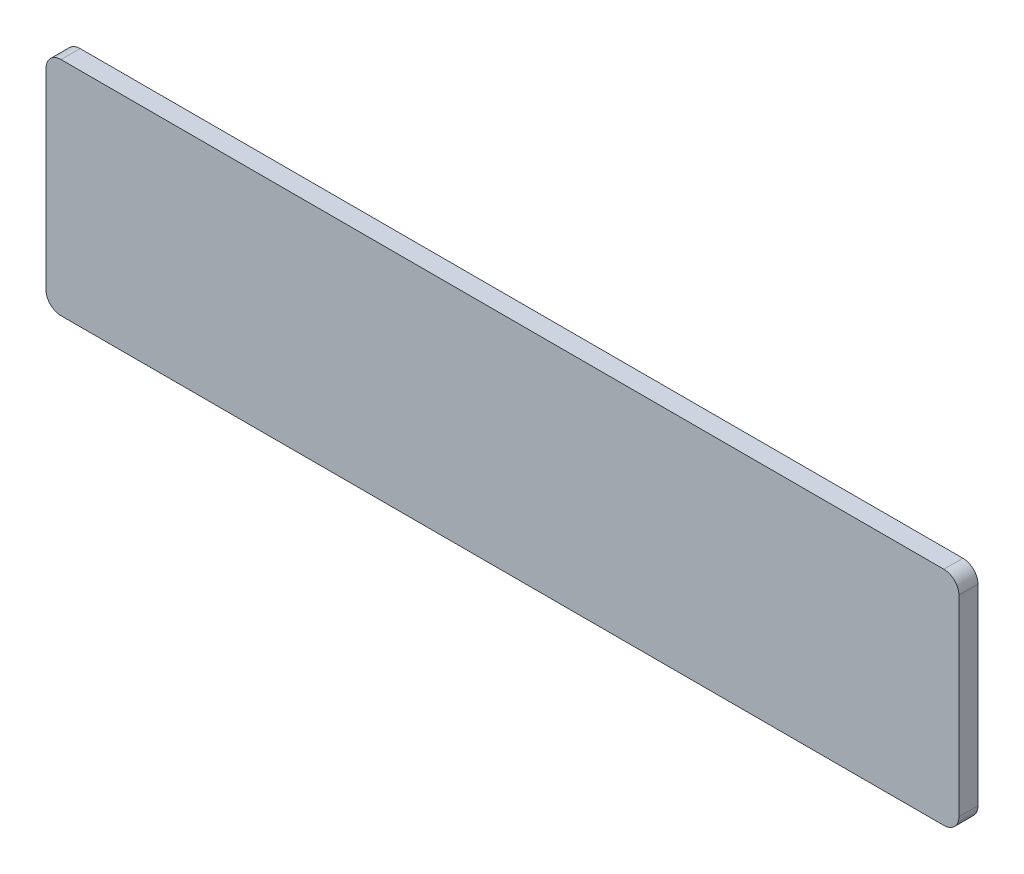
ISO-10303-21;
HEADER;
FILE_DESCRIPTION(('STEP AP214'),'2;1');
FILE_NAME('part.step','',(''),(''),'','','');
FILE_SCHEMA(('AUTOMOTIVE_DESIGN { 1 0 10303 214 1 1 1 1 }'));
ENDSEC;
DATA;
#1=APPLICATION_CONTEXT('core data for automotive mechanical design processes');
#2=APPLICATION_PROTOCOL_DEFINITION('international standard','automotive_design',2000,#1);
#3=PRODUCT_CONTEXT('',#1,'mechanical');
#4=PRODUCT('Part','Part','',(#3));
#5=PRODUCT_RELATED_PRODUCT_CATEGORY('part','',(#4));
#6=PRODUCT_DEFINITION_FORMATION('','',#4);
#7=PRODUCT_DEFINITION_CONTEXT('part definition',#1,'design');
#8=PRODUCT_DEFINITION('design','',#6,#7);
#9=PRODUCT_DEFINITION_SHAPE('','',#8);
#10=(LENGTH_UNIT() NAMED_UNIT(*) SI_UNIT(.MILLI.,.METRE.));
#11=(NAMED_UNIT(*) PLANE_ANGLE_UNIT() SI_UNIT($,.RADIAN.));
#12=(NAMED_UNIT(*) SI_UNIT($,.STERADIAN.) SOLID_ANGLE_UNIT());
#13=UNCERTAINTY_MEASURE_WITH_UNIT(LENGTH_MEASURE(1.E-05),#10,'distance_accuracy_value','');
#14=(GEOMETRIC_REPRESENTATION_CONTEXT(3) GLOBAL_UNCERTAINTY_ASSIGNED_CONTEXT((#13)) GLOBAL_UNIT_ASSIGNED_CONTEXT((#10,
#11,#12)) REPRESENTATION_CONTEXT('',''));
#15=CARTESIAN_POINT('',(0.,0.,0.));
#16=DIRECTION('',(0.,0.,1.));
#17=DIRECTION('',(1.,0.,0.));
#18=AXIS2_PLACEMENT_3D('',#15,#16,#17);
#19=CARTESIAN_POINT('',(0.,0.,12.7));
#20=DIRECTION('',(-1.,0.,0.));
#21=DIRECTION('',(0.,0.,1.));
#22=AXIS2_PLACEMENT_3D('',#19,#20,#21);
#23=PLANE('',#22);
#24=DIRECTION('',(0.,1.,0.));
#25=VECTOR('',#24,1.);
#26=CARTESIAN_POINT('',(0.,0.,12.7));
#27=LINE('',#26,#25);
#28=CARTESIAN_POINT('',(0.,10.,12.7));
#29=VERTEX_POINT('',#28);
#30=CARTESIAN_POINT('',(0.,137.67,12.7));
#31=VERTEX_POINT('',#30);
#32=EDGE_CURVE('E130',#29,#31,#27,.T.);
#33=ORIENTED_EDGE('',*,*,#32,.F.);
#34=DIRECTION('',(0.,0.,-1.));
#35=VECTOR('',#34,1.);
#36=CARTESIAN_POINT('',(0.,10.,12.7));
#37=LINE('',#36,#35);
#38=CARTESIAN_POINT('',(0.,10.,0.));
#39=VERTEX_POINT('',#38);
#40=EDGE_CURVE('E114',#29,#39,#37,.T.);
#41=ORIENTED_EDGE('',*,*,#40,.T.);
#42=DIRECTION('',(0.,1.,0.));
#43=VECTOR('',#42,1.);
#44=CARTESIAN_POINT('',(0.,0.,0.));
#45=LINE('',#44,#43);
#46=CARTESIAN_POINT('',(0.,137.67,0.));
#47=VERTEX_POINT('',#46);
#48=EDGE_CURVE('E127',#39,#47,#45,.T.);
#49=ORIENTED_EDGE('',*,*,#48,.T.);
#50=DIRECTION('',(0.,0.,-1.));
#51=VECTOR('',#50,1.);
#52=CARTESIAN_POINT('',(0.,137.67,12.7));
#53=LINE('',#52,#51);
#54=EDGE_CURVE('E133',#47,#31,#53,.F.);
#55=ORIENTED_EDGE('',*,*,#54,.T.);
#56=EDGE_LOOP('',(#33,#41,#49,#55));
#57=FACE_BOUND('',#56,.T.);
#58=ADVANCED_FACE('F43',(#57),#23,.F.);
#59=CARTESIAN_POINT('',(0.,147.67,12.7));
#60=DIRECTION('',(0.,-1.,0.));
#61=DIRECTION('',(1.,0.,0.));
#62=AXIS2_PLACEMENT_3D('',#59,#60,#61);
#63=PLANE('',#62);
#64=DIRECTION('',(-1.,0.,0.));
#65=VECTOR('',#64,1.);
#66=CARTESIAN_POINT('',(0.,147.67,0.));
#67=LINE('',#66,#65);
#68=CARTESIAN_POINT('',(-10.,147.67,0.));
#69=VERTEX_POINT('',#68);
#70=CARTESIAN_POINT('',(-597.57,147.67,0.));
#71=VERTEX_POINT('',#70);
#72=EDGE_CURVE('E138',#69,#71,#67,.T.);
#73=ORIENTED_EDGE('',*,*,#72,.T.);
#74=DIRECTION('',(0.,0.,-1.));
#75=VECTOR('',#74,1.);
#76=CARTESIAN_POINT('',(-597.57,147.67,12.7));
#77=LINE('',#76,#75);
#78=CARTESIAN_POINT('',(-597.57,147.67,12.7));
#79=VERTEX_POINT('',#78);
#80=EDGE_CURVE('E11',#71,#79,#77,.F.);
#81=ORIENTED_EDGE('',*,*,#80,.T.);
#82=DIRECTION('',(-1.,0.,0.));
#83=VECTOR('',#82,1.);
#84=CARTESIAN_POINT('',(0.,147.67,12.7));
#85=LINE('',#84,#83);
#86=CARTESIAN_POINT('',(-10.,147.67,12.7));
#87=VERTEX_POINT('',#86);
#88=EDGE_CURVE('E190',#87,#79,#85,.T.);
#89=ORIENTED_EDGE('',*,*,#88,.F.);
#90=DIRECTION('',(0.,0.,-1.));
#91=VECTOR('',#90,1.);
#92=CARTESIAN_POINT('',(-10.,147.67,12.7));
#93=LINE('',#92,#91);
#94=EDGE_CURVE('E52',#87,#69,#93,.T.);
#95=ORIENTED_EDGE('',*,*,#94,.T.);
#96=EDGE_LOOP('',(#73,#81,#89,#95));
#97=FACE_BOUND('',#96,.T.);
#98=ADVANCED_FACE('F188',(#97),#63,.F.);
#99=CARTESIAN_POINT('',(-607.57,0.,12.7));
#100=DIRECTION('',(1.,0.,0.));
#101=DIRECTION('',(0.,0.,-1.));
#102=AXIS2_PLACEMENT_3D('',#99,#100,#101);
#103=PLANE('',#102);
#104=DIRECTION('',(0.,-1.,0.));
#105=VECTOR('',#104,1.);
#106=CARTESIAN_POINT('',(-607.57,0.,0.));
#107=LINE('',#106,#105);
#108=CARTESIAN_POINT('',(-607.57,137.67,0.));
#109=VERTEX_POINT('',#108);
#110=CARTESIAN_POINT('',(-607.57,10.,0.));
#111=VERTEX_POINT('',#110);
#112=EDGE_CURVE('E142',#109,#111,#107,.T.);
#113=ORIENTED_EDGE('',*,*,#112,.T.);
#114=DIRECTION('',(0.,0.,-1.));
#115=VECTOR('',#114,1.);
#116=CARTESIAN_POINT('',(-607.57,10.,12.7));
#117=LINE('',#116,#115);
#118=CARTESIAN_POINT('',(-607.57,10.,12.7));
#119=VERTEX_POINT('',#118);
#120=EDGE_CURVE('E59',#111,#119,#117,.F.);
#121=ORIENTED_EDGE('',*,*,#120,.T.);
#122=DIRECTION('',(0.,-1.,0.));
#123=VECTOR('',#122,1.);
#124=CARTESIAN_POINT('',(-607.57,0.,12.7));
#125=LINE('',#124,#123);
#126=CARTESIAN_POINT('',(-607.57,137.67,12.7));
#127=VERTEX_POINT('',#126);
#128=EDGE_CURVE('E198',#127,#119,#125,.T.);
#129=ORIENTED_EDGE('',*,*,#128,.F.);
#130=DIRECTION('',(0.,0.,-1.));
#131=VECTOR('',#130,1.);
#132=CARTESIAN_POINT('',(-607.57,137.67,12.7));
#133=LINE('',#132,#131);
#134=EDGE_CURVE('E178',#127,#109,#133,.T.);
#135=ORIENTED_EDGE('',*,*,#134,.T.);
#136=EDGE_LOOP('',(#113,#121,#129,#135));
#137=FACE_BOUND('',#136,.T.);
#138=ADVANCED_FACE('F197',(#137),#103,.F.);
#139=CARTESIAN_POINT('',(0.,0.,12.7));
#140=DIRECTION('',(0.,1.,0.));
#141=DIRECTION('',(0.,0.,1.));
#142=AXIS2_PLACEMENT_3D('',#139,#140,#141);
#143=PLANE('',#142);
#144=DIRECTION('',(1.,0.,0.));
#145=VECTOR('',#144,1.);
#146=CARTESIAN_POINT('',(0.,0.,0.));
#147=LINE('',#146,#145);
#148=CARTESIAN_POINT('',(-597.57,0.,0.));
#149=VERTEX_POINT('',#148);
#150=CARTESIAN_POINT('',(-10.,0.,0.));
#151=VERTEX_POINT('',#150);
#152=EDGE_CURVE('E150',#149,#151,#147,.T.);
#153=ORIENTED_EDGE('',*,*,#152,.T.);
#154=DIRECTION('',(0.,0.,-1.));
#155=VECTOR('',#154,1.);
#156=CARTESIAN_POINT('',(-10.,0.,12.7));
#157=LINE('',#156,#155);
#158=CARTESIAN_POINT('',(-10.,0.,12.7));
#159=VERTEX_POINT('',#158);
#160=EDGE_CURVE('E115',#151,#159,#157,.F.);
#161=ORIENTED_EDGE('',*,*,#160,.T.);
#162=DIRECTION('',(1.,0.,0.));
#163=VECTOR('',#162,1.);
#164=CARTESIAN_POINT('',(0.,0.,12.7));
#165=LINE('',#164,#163);
#166=CARTESIAN_POINT('',(-597.57,0.,12.7));
#167=VERTEX_POINT('',#166);
#168=EDGE_CURVE('E145',#167,#159,#165,.T.);
#169=ORIENTED_EDGE('',*,*,#168,.F.);
#170=DIRECTION('',(0.,0.,-1.));
#171=VECTOR('',#170,1.);
#172=CARTESIAN_POINT('',(-597.57,0.,12.7));
#173=LINE('',#172,#171);
#174=EDGE_CURVE('E121',#167,#149,#173,.T.);
#175=ORIENTED_EDGE('',*,*,#174,.T.);
#176=EDGE_LOOP('',(#153,#161,#169,#175));
#177=FACE_BOUND('',#176,.T.);
#178=ADVANCED_FACE('F230',(#177),#143,.F.);
#179=CARTESIAN_POINT('',(0.,0.,12.7));
#180=DIRECTION('',(0.,0.,1.));
#181=DIRECTION('',(1.,0.,0.));
#182=AXIS2_PLACEMENT_3D('',#179,#180,#181);
#183=PLANE('',#182);
#184=ORIENTED_EDGE('',*,*,#168,.T.);
#185=CARTESIAN_POINT('',(-10.,10.,12.7));
#186=DIRECTION('',(0.,0.,1.));
#187=DIRECTION('',(1.,0.,0.));
#188=AXIS2_PLACEMENT_3D('',#185,#186,#187);
#189=CIRCLE('',#188,10.);
#190=EDGE_CURVE('E175',#159,#29,#189,.T.);
#191=ORIENTED_EDGE('',*,*,#190,.T.);
#192=ORIENTED_EDGE('',*,*,#32,.T.);
#193=CARTESIAN_POINT('',(-10.,137.67,12.7));
#194=DIRECTION('',(0.,0.,1.));
#195=DIRECTION('',(1.,0.,0.));
#196=AXIS2_PLACEMENT_3D('',#193,#194,#195);
#197=CIRCLE('',#196,10.);
#198=EDGE_CURVE('E167',#31,#87,#197,.T.);
#199=ORIENTED_EDGE('',*,*,#198,.T.);
#200=ORIENTED_EDGE('',*,*,#88,.T.);
#201=CARTESIAN_POINT('',(-597.57,137.67,12.7));
#202=DIRECTION('',(0.,0.,1.));
#203=DIRECTION('',(1.,0.,0.));
#204=AXIS2_PLACEMENT_3D('',#201,#202,#203);
#205=CIRCLE('',#204,10.);
#206=EDGE_CURVE('E66',#79,#127,#205,.T.);
#207=ORIENTED_EDGE('',*,*,#206,.T.);
#208=ORIENTED_EDGE('',*,*,#128,.T.);
#209=CARTESIAN_POINT('',(-597.57,10.,12.7));
#210=DIRECTION('',(0.,0.,1.));
#211=DIRECTION('',(1.,0.,0.));
#212=AXIS2_PLACEMENT_3D('',#209,#210,#211);
#213=CIRCLE('',#212,10.);
#214=EDGE_CURVE('E172',#119,#167,#213,.T.);
#215=ORIENTED_EDGE('',*,*,#214,.T.);
#216=EDGE_LOOP('',(#184,#191,#192,#199,#200,#207,#208,#215));
#217=FACE_BOUND('',#216,.T.);
#218=ADVANCED_FACE('F207',(#217),#183,.T.);
#219=CARTESIAN_POINT('',(0.,0.,0.));
#220=DIRECTION('',(0.,0.,1.));
#221=DIRECTION('',(1.,0.,0.));
#222=AXIS2_PLACEMENT_3D('',#219,#220,#221);
#223=PLANE('',#222);
#224=ORIENTED_EDGE('',*,*,#48,.F.);
#225=CARTESIAN_POINT('',(-10.,10.,0.));
#226=DIRECTION('',(0.,0.,1.));
#227=DIRECTION('',(1.,0.,0.));
#228=AXIS2_PLACEMENT_3D('',#225,#226,#227);
#229=CIRCLE('',#228,10.);
#230=EDGE_CURVE('E110',#39,#151,#229,.F.);
#231=ORIENTED_EDGE('',*,*,#230,.T.);
#232=ORIENTED_EDGE('',*,*,#152,.F.);
#233=CARTESIAN_POINT('',(-597.57,10.,0.));
#234=DIRECTION('',(0.,0.,1.));
#235=DIRECTION('',(1.,0.,0.));
#236=AXIS2_PLACEMENT_3D('',#233,#234,#235);
#237=CIRCLE('',#236,10.);
#238=EDGE_CURVE('E122',#149,#111,#237,.F.);
#239=ORIENTED_EDGE('',*,*,#238,.T.);
#240=ORIENTED_EDGE('',*,*,#112,.F.);
#241=CARTESIAN_POINT('',(-597.57,137.67,0.));
#242=DIRECTION('',(0.,0.,1.));
#243=DIRECTION('',(1.,0.,0.));
#244=AXIS2_PLACEMENT_3D('',#241,#242,#243);
#245=CIRCLE('',#244,10.);
#246=EDGE_CURVE('E157',#109,#71,#245,.F.);
#247=ORIENTED_EDGE('',*,*,#246,.T.);
#248=ORIENTED_EDGE('',*,*,#72,.F.);
#249=CARTESIAN_POINT('',(-10.,137.67,0.));
#250=DIRECTION('',(0.,0.,1.));
#251=DIRECTION('',(1.,0.,0.));
#252=AXIS2_PLACEMENT_3D('',#249,#250,#251);
#253=CIRCLE('',#252,10.);
#254=EDGE_CURVE('E132',#69,#47,#253,.F.);
#255=ORIENTED_EDGE('',*,*,#254,.T.);
#256=EDGE_LOOP('',(#224,#231,#232,#239,#240,#247,#248,#255));
#257=FACE_BOUND('',#256,.T.);
#258=ADVANCED_FACE('F135',(#257),#223,.F.);
#259=CARTESIAN_POINT('',(-10.,10.,12.7));
#260=DIRECTION('',(0.,0.,-1.));
#261=DIRECTION('',(-1.,0.,0.));
#262=AXIS2_PLACEMENT_3D('',#259,#260,#261);
#263=CYLINDRICAL_SURFACE('',#262,10.);
#264=ORIENTED_EDGE('',*,*,#190,.F.);
#265=ORIENTED_EDGE('',*,*,#160,.F.);
#266=ORIENTED_EDGE('',*,*,#230,.F.);
#267=ORIENTED_EDGE('',*,*,#40,.F.);
#268=EDGE_LOOP('',(#264,#265,#266,#267));
#269=FACE_BOUND('',#268,.T.);
#270=ADVANCED_FACE('F113',(#269),#263,.T.);
#271=CARTESIAN_POINT('',(-597.57,10.,12.7));
#272=DIRECTION('',(0.,0.,-1.));
#273=DIRECTION('',(-1.,0.,0.));
#274=AXIS2_PLACEMENT_3D('',#271,#272,#273);
#275=CYLINDRICAL_SURFACE('',#274,10.);
#276=ORIENTED_EDGE('',*,*,#214,.F.);
#277=ORIENTED_EDGE('',*,*,#120,.F.);
#278=ORIENTED_EDGE('',*,*,#238,.F.);
#279=ORIENTED_EDGE('',*,*,#174,.F.);
#280=EDGE_LOOP('',(#276,#277,#278,#279));
#281=FACE_BOUND('',#280,.T.);
#282=ADVANCED_FACE('F212',(#281),#275,.T.);
#283=CARTESIAN_POINT('',(-597.57,137.67,12.7));
#284=DIRECTION('',(0.,0.,-1.));
#285=DIRECTION('',(-1.,0.,0.));
#286=AXIS2_PLACEMENT_3D('',#283,#284,#285);
#287=CYLINDRICAL_SURFACE('',#286,10.);
#288=ORIENTED_EDGE('',*,*,#206,.F.);
#289=ORIENTED_EDGE('',*,*,#80,.F.);
#290=ORIENTED_EDGE('',*,*,#246,.F.);
#291=ORIENTED_EDGE('',*,*,#134,.F.);
#292=EDGE_LOOP('',(#288,#289,#290,#291));
#293=FACE_BOUND('',#292,.T.);
#294=ADVANCED_FACE('F196',(#293),#287,.T.);
#295=CARTESIAN_POINT('',(-10.,137.67,12.7));
#296=DIRECTION('',(0.,0.,-1.));
#297=DIRECTION('',(-1.,0.,0.));
#298=AXIS2_PLACEMENT_3D('',#295,#296,#297);
#299=CYLINDRICAL_SURFACE('',#298,10.);
#300=ORIENTED_EDGE('',*,*,#198,.F.);
#301=ORIENTED_EDGE('',*,*,#54,.F.);
#302=ORIENTED_EDGE('',*,*,#254,.F.);
#303=ORIENTED_EDGE('',*,*,#94,.F.);
#304=EDGE_LOOP('',(#300,#301,#302,#303));
#305=FACE_BOUND('',#304,.T.);
#306=ADVANCED_FACE('F45',(#305),#299,.T.);
#307=CLOSED_SHELL('',(#58,#98,#138,#178,#218,#258,#270,#282,#294,#306));
#308=MANIFOLD_SOLID_BREP('B2',#307);
#309=ADVANCED_BREP_SHAPE_REPRESENTATION('',(#18,#308),#14);
#310=SHAPE_DEFINITION_REPRESENTATION(#9,#309);
ENDSEC;
END-ISO-10303-21;
